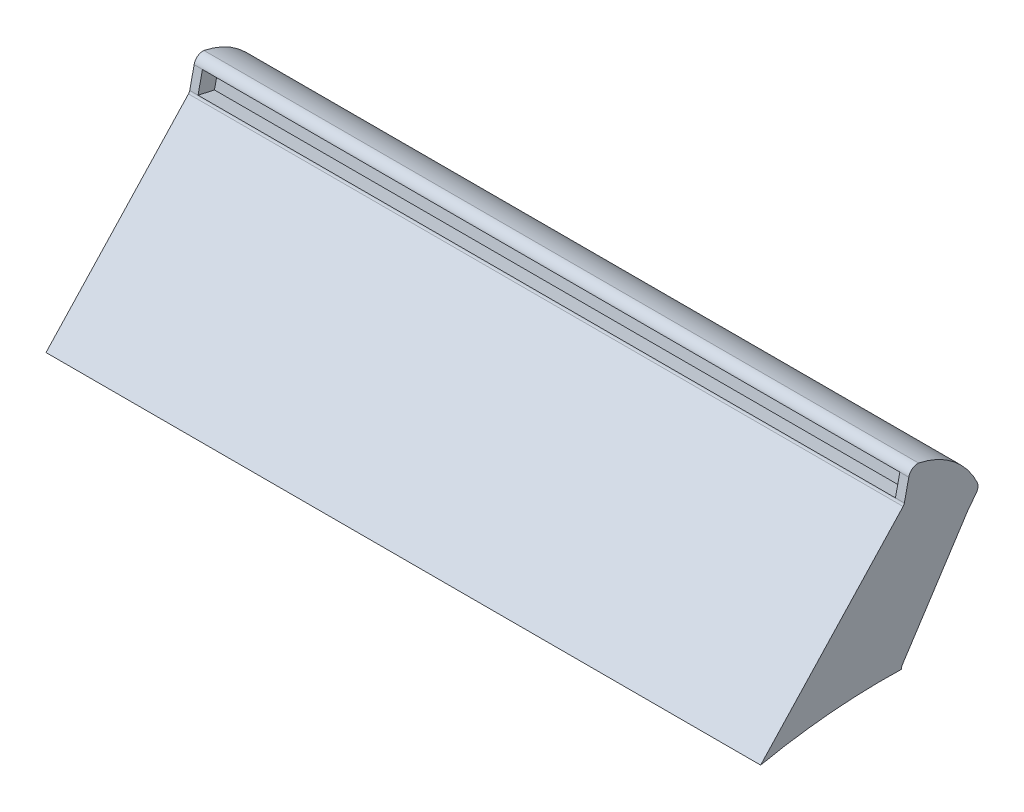
ISO-10303-21;
HEADER;
FILE_DESCRIPTION(('STEP AP214'),'2;1');
FILE_NAME('part.step','',(''),(''),'','','');
FILE_SCHEMA(('AUTOMOTIVE_DESIGN { 1 0 10303 214 1 1 1 1 }'));
ENDSEC;
DATA;
#1=APPLICATION_CONTEXT('core data for automotive mechanical design processes');
#2=APPLICATION_PROTOCOL_DEFINITION('international standard','automotive_design',2000,#1);
#3=PRODUCT_CONTEXT('',#1,'mechanical');
#4=PRODUCT('Part','Part','',(#3));
#5=PRODUCT_RELATED_PRODUCT_CATEGORY('part','',(#4));
#6=PRODUCT_DEFINITION_FORMATION('','',#4);
#7=PRODUCT_DEFINITION_CONTEXT('part definition',#1,'design');
#8=PRODUCT_DEFINITION('design','',#6,#7);
#9=PRODUCT_DEFINITION_SHAPE('','',#8);
#10=(LENGTH_UNIT() NAMED_UNIT(*) SI_UNIT(.MILLI.,.METRE.));
#11=(NAMED_UNIT(*) PLANE_ANGLE_UNIT() SI_UNIT($,.RADIAN.));
#12=(NAMED_UNIT(*) SI_UNIT($,.STERADIAN.) SOLID_ANGLE_UNIT());
#13=UNCERTAINTY_MEASURE_WITH_UNIT(LENGTH_MEASURE(1.E-05),#10,'distance_accuracy_value','');
#14=(GEOMETRIC_REPRESENTATION_CONTEXT(3) GLOBAL_UNCERTAINTY_ASSIGNED_CONTEXT((#13)) GLOBAL_UNIT_ASSIGNED_CONTEXT((#10,
#11,#12)) REPRESENTATION_CONTEXT('',''));
#15=CARTESIAN_POINT('',(0.,0.,0.));
#16=DIRECTION('',(0.,0.,1.));
#17=DIRECTION('',(1.,0.,0.));
#18=AXIS2_PLACEMENT_3D('',#15,#16,#17);
#19=CARTESIAN_POINT('',(850.,91.6693855460782,-23.2081270688611));
#20=DIRECTION('',(0.,-0.214598816365285,-0.976702282179487));
#21=DIRECTION('',(0.,0.976702282179487,-0.214598816365285));
#22=AXIS2_PLACEMENT_3D('',#19,#20,#21);
#23=PLANE('',#22);
#24=DIRECTION('',(-1.,0.,0.));
#25=VECTOR('',#24,1.);
#26=CARTESIAN_POINT('',(850.,91.6693855460782,-23.2081270688611));
#27=LINE('',#26,#25);
#28=CARTESIAN_POINT('',(9.87711763302313,91.6693855460782,-23.2081270688611));
#29=VERTEX_POINT('',#28);
#30=CARTESIAN_POINT('',(0.,91.6693855460782,-23.2081270688611));
#31=VERTEX_POINT('',#30);
#32=EDGE_CURVE('E148',#29,#31,#27,.T.);
#33=ORIENTED_EDGE('',*,*,#32,.F.);
#34=DIRECTION('',(0.,-0.976702282179487,0.214598816365285));
#35=VECTOR('',#34,1.);
#36=CARTESIAN_POINT('',(9.87711763302313,91.6693855460782,-23.2081270688611));
#37=LINE('',#36,#35);
#38=CARTESIAN_POINT('',(9.87711763302313,115.61840829184,-28.4701521793966));
#39=VERTEX_POINT('',#38);
#40=EDGE_CURVE('E48',#39,#29,#37,.T.);
#41=ORIENTED_EDGE('',*,*,#40,.F.);
#42=DIRECTION('',(-1.,0.,0.));
#43=VECTOR('',#42,1.);
#44=CARTESIAN_POINT('',(850.,115.61840829184,-28.4701521793966));
#45=LINE('',#44,#43);
#46=CARTESIAN_POINT('',(0.,115.61840829184,-28.4701521793966));
#47=VERTEX_POINT('',#46);
#48=EDGE_CURVE('E147',#39,#47,#45,.T.);
#49=ORIENTED_EDGE('',*,*,#48,.T.);
#50=DIRECTION('',(0.,-0.976702282179487,0.214598816365285));
#51=VECTOR('',#50,1.);
#52=CARTESIAN_POINT('',(0.,91.6693855460782,-23.2081270688611));
#53=LINE('',#52,#51);
#54=EDGE_CURVE('E204',#47,#31,#53,.T.);
#55=ORIENTED_EDGE('',*,*,#54,.T.);
#56=EDGE_LOOP('',(#33,#41,#49,#55));
#57=FACE_BOUND('',#56,.T.);
#58=ADVANCED_FACE('F33',(#57),#23,.F.);
#59=CARTESIAN_POINT('',(850.,-798.341819729579,0.409279889670433));
#60=DIRECTION('',(-1.,0.,0.));
#61=DIRECTION('',(0.,0.,1.));
#62=AXIS2_PLACEMENT_3D('',#59,#60,#61);
#63=CYLINDRICAL_SURFACE('',#62,720.751714267608);
#64=CARTESIAN_POINT('',(0.,-798.341819729579,0.409279889670433));
#65=DIRECTION('',(-1.,0.,0.));
#66=DIRECTION('',(0.,0.,-1.));
#67=AXIS2_PLACEMENT_3D('',#64,#65,#66);
#68=CIRCLE('',#67,720.751714267608);
#69=CARTESIAN_POINT('',(0.,-92.8090408894732,147.740646549501));
#70=VERTEX_POINT('',#69);
#71=CARTESIAN_POINT('',(0.,-77.868977882478,-19.6386072922121));
#72=VERTEX_POINT('',#71);
#73=EDGE_CURVE('E221',#70,#72,#68,.T.);
#74=ORIENTED_EDGE('',*,*,#73,.T.);
#75=DIRECTION('',(-1.,0.,0.));
#76=VECTOR('',#75,1.);
#77=CARTESIAN_POINT('',(850.,-77.868977882478,-19.6386072922121));
#78=LINE('',#77,#76);
#79=CARTESIAN_POINT('',(850.,-77.868977882478,-19.6386072922121));
#80=VERTEX_POINT('',#79);
#81=EDGE_CURVE('E11',#80,#72,#78,.T.);
#82=ORIENTED_EDGE('',*,*,#81,.F.);
#83=CARTESIAN_POINT('',(850.,-798.341819729579,0.409279889670433));
#84=DIRECTION('',(-1.,0.,0.));
#85=DIRECTION('',(0.,0.,-1.));
#86=AXIS2_PLACEMENT_3D('',#83,#84,#85);
#87=CIRCLE('',#86,720.751714267608);
#88=CARTESIAN_POINT('',(850.,-92.8090408894732,147.740646549501));
#89=VERTEX_POINT('',#88);
#90=EDGE_CURVE('E231',#89,#80,#87,.T.);
#91=ORIENTED_EDGE('',*,*,#90,.F.);
#92=DIRECTION('',(-1.,0.,0.));
#93=VECTOR('',#92,1.);
#94=CARTESIAN_POINT('',(850.,-92.8090408894732,147.740646549501));
#95=LINE('',#94,#93);
#96=EDGE_CURVE('E153',#89,#70,#95,.T.);
#97=ORIENTED_EDGE('',*,*,#96,.T.);
#98=EDGE_LOOP('',(#74,#82,#91,#97));
#99=FACE_BOUND('',#98,.T.);
#100=ADVANCED_FACE('F35',(#99),#63,.F.);
#101=CARTESIAN_POINT('',(850.,-77.8689778824766,-27.6386072922086));
#102=DIRECTION('',(-1.,0.,0.));
#103=DIRECTION('',(0.,0.,1.));
#104=AXIS2_PLACEMENT_3D('',#101,#102,#103);
#105=CYLINDRICAL_SURFACE('',#104,7.99999999999646);
#106=CARTESIAN_POINT('',(0.,-77.8689778824766,-27.6386072922086));
#107=DIRECTION('',(-1.,0.,0.));
#108=DIRECTION('',(0.,0.,-1.));
#109=AXIS2_PLACEMENT_3D('',#106,#107,#108);
#110=CIRCLE('',#109,7.99999999999646);
#111=CARTESIAN_POINT('',(0.,-73.5118656023578,-20.9292427486485));
#112=VERTEX_POINT('',#111);
#113=EDGE_CURVE('E275',#72,#112,#110,.T.);
#114=ORIENTED_EDGE('',*,*,#113,.T.);
#115=DIRECTION('',(-1.,0.,0.));
#116=VECTOR('',#115,1.);
#117=CARTESIAN_POINT('',(850.,-73.5118656023578,-20.9292427486485));
#118=LINE('',#117,#116);
#119=CARTESIAN_POINT('',(850.,-73.5118656023578,-20.9292427486485));
#120=VERTEX_POINT('',#119);
#121=EDGE_CURVE('E41',#120,#112,#118,.T.);
#122=ORIENTED_EDGE('',*,*,#121,.F.);
#123=CARTESIAN_POINT('',(850.,-77.8689778824766,-27.6386072922086));
#124=DIRECTION('',(-1.,0.,0.));
#125=DIRECTION('',(0.,0.,-1.));
#126=AXIS2_PLACEMENT_3D('',#123,#124,#125);
#127=CIRCLE('',#126,7.99999999999646);
#128=EDGE_CURVE('E104',#80,#120,#127,.T.);
#129=ORIENTED_EDGE('',*,*,#128,.F.);
#130=ORIENTED_EDGE('',*,*,#81,.T.);
#131=EDGE_LOOP('',(#114,#122,#129,#130));
#132=FACE_BOUND('',#131,.T.);
#133=ADVANCED_FACE('F189',(#132),#105,.F.);
#134=CARTESIAN_POINT('',(850.,47.4132262786012,-99.4589156242478));
#135=DIRECTION('',(0.,0.544639035015017,0.838670567945431));
#136=DIRECTION('',(0.,-0.838670567945431,0.544639035015017));
#137=AXIS2_PLACEMENT_3D('',#134,#135,#136);
#138=PLANE('',#137);
#139=DIRECTION('',(0.,0.838670567945431,-0.544639035015017));
#140=VECTOR('',#139,1.);
#141=CARTESIAN_POINT('',(0.,47.4132262786012,-99.4589156242478));
#142=LINE('',#141,#140);
#143=CARTESIAN_POINT('',(0.,47.4132262786012,-99.4589156242478));
#144=VERTEX_POINT('',#143);
#145=EDGE_CURVE('E270',#112,#144,#142,.T.);
#146=ORIENTED_EDGE('',*,*,#145,.T.);
#147=DIRECTION('',(-1.,0.,0.));
#148=VECTOR('',#147,1.);
#149=CARTESIAN_POINT('',(850.,47.4132262786012,-99.4589156242478));
#150=LINE('',#149,#148);
#151=CARTESIAN_POINT('',(850.,47.4132262786012,-99.4589156242478));
#152=VERTEX_POINT('',#151);
#153=EDGE_CURVE('E264',#152,#144,#150,.T.);
#154=ORIENTED_EDGE('',*,*,#153,.F.);
#155=DIRECTION('',(0.,0.838670567945431,-0.544639035015017));
#156=VECTOR('',#155,1.);
#157=CARTESIAN_POINT('',(850.,47.4132262786012,-99.4589156242478));
#158=LINE('',#157,#156);
#159=EDGE_CURVE('E234',#120,#152,#158,.T.);
#160=ORIENTED_EDGE('',*,*,#159,.F.);
#161=ORIENTED_EDGE('',*,*,#121,.T.);
#162=EDGE_LOOP('',(#146,#154,#160,#161));
#163=FACE_BOUND('',#162,.T.);
#164=ADVANCED_FACE('F186',(#163),#138,.F.);
#165=CARTESIAN_POINT('',(850.,59.907923142311,-109.338647669992));
#166=DIRECTION('',(0.,0.620243475564822,0.784409351690347));
#167=DIRECTION('',(0.,-0.784409351690347,0.620243475564822));
#168=AXIS2_PLACEMENT_3D('',#165,#166,#167);
#169=PLANE('',#168);
#170=DIRECTION('',(0.,0.784409351690347,-0.620243475564822));
#171=VECTOR('',#170,1.);
#172=CARTESIAN_POINT('',(0.,59.907923142311,-109.338647669992));
#173=LINE('',#172,#171);
#174=CARTESIAN_POINT('',(0.,59.907923142311,-109.338647669992));
#175=VERTEX_POINT('',#174);
#176=EDGE_CURVE('E277',#144,#175,#173,.T.);
#177=ORIENTED_EDGE('',*,*,#176,.T.);
#178=DIRECTION('',(-1.,0.,0.));
#179=VECTOR('',#178,1.);
#180=CARTESIAN_POINT('',(850.,59.907923142311,-109.338647669992));
#181=LINE('',#180,#179);
#182=CARTESIAN_POINT('',(850.,59.907923142311,-109.338647669992));
#183=VERTEX_POINT('',#182);
#184=EDGE_CURVE('E261',#183,#175,#181,.T.);
#185=ORIENTED_EDGE('',*,*,#184,.F.);
#186=DIRECTION('',(0.,0.784409351690347,-0.620243475564822));
#187=VECTOR('',#186,1.);
#188=CARTESIAN_POINT('',(850.,59.907923142311,-109.338647669992));
#189=LINE('',#188,#187);
#190=EDGE_CURVE('E236',#152,#183,#189,.T.);
#191=ORIENTED_EDGE('',*,*,#190,.F.);
#192=ORIENTED_EDGE('',*,*,#153,.T.);
#193=EDGE_LOOP('',(#177,#185,#191,#192));
#194=FACE_BOUND('',#193,.T.);
#195=ADVANCED_FACE('F182',(#194),#169,.F.);
#196=CARTESIAN_POINT('',(850.,65.3643259516161,-100.015089589692));
#197=DIRECTION('',(-1.,0.,0.));
#198=DIRECTION('',(0.,0.,1.));
#199=AXIS2_PLACEMENT_3D('',#196,#197,#198);
#200=CYLINDRICAL_SURFACE('',#199,10.802826801079);
#201=CARTESIAN_POINT('',(0.,65.3643259516161,-100.015089589692));
#202=DIRECTION('',(1.,0.,0.));
#203=DIRECTION('',(0.,0.,1.));
#204=AXIS2_PLACEMENT_3D('',#201,#202,#203);
#205=CIRCLE('',#204,10.802826801079);
#206=CARTESIAN_POINT('',(0.,69.5374016311797,-109.979351040836));
#207=VERTEX_POINT('',#206);
#208=EDGE_CURVE('E279',#175,#207,#205,.T.);
#209=ORIENTED_EDGE('',*,*,#208,.T.);
#210=DIRECTION('',(-1.,0.,0.));
#211=VECTOR('',#210,1.);
#212=CARTESIAN_POINT('',(850.,69.5374016311797,-109.979351040836));
#213=LINE('',#212,#211);
#214=CARTESIAN_POINT('',(850.,69.5374016311797,-109.979351040836));
#215=VERTEX_POINT('',#214);
#216=EDGE_CURVE('E252',#215,#207,#213,.T.);
#217=ORIENTED_EDGE('',*,*,#216,.F.);
#218=CARTESIAN_POINT('',(850.,65.3643259516161,-100.015089589692));
#219=DIRECTION('',(1.,0.,0.));
#220=DIRECTION('',(0.,0.,1.));
#221=AXIS2_PLACEMENT_3D('',#218,#219,#220);
#222=CIRCLE('',#221,10.802826801079);
#223=EDGE_CURVE('E238',#183,#215,#222,.T.);
#224=ORIENTED_EDGE('',*,*,#223,.F.);
#225=ORIENTED_EDGE('',*,*,#184,.T.);
#226=EDGE_LOOP('',(#209,#217,#224,#225));
#227=FACE_BOUND('',#226,.T.);
#228=ADVANCED_FACE('F178',(#227),#200,.T.);
#229=CARTESIAN_POINT('',(850.,26.8020066557608,-19.9145494502848));
#230=DIRECTION('',(-1.,0.,0.));
#231=DIRECTION('',(0.,0.,1.));
#232=AXIS2_PLACEMENT_3D('',#229,#230,#231);
#233=CYLINDRICAL_SURFACE('',#232,99.689430077869);
#234=CARTESIAN_POINT('',(0.,26.8020066557608,-19.9145494502848));
#235=DIRECTION('',(1.,0.,0.));
#236=DIRECTION('',(0.,0.,1.));
#237=AXIS2_PLACEMENT_3D('',#234,#235,#236);
#238=CIRCLE('',#237,99.689430077869);
#239=CARTESIAN_POINT('',(0.,124.42758644127,-40.0944563081866));
#240=VERTEX_POINT('',#239);
#241=EDGE_CURVE('E249',#207,#240,#238,.T.);
#242=ORIENTED_EDGE('',*,*,#241,.T.);
#243=DIRECTION('',(-1.,0.,0.));
#244=VECTOR('',#243,1.);
#245=CARTESIAN_POINT('',(850.,124.42758644127,-40.0944563081866));
#246=LINE('',#245,#244);
#247=CARTESIAN_POINT('',(850.,124.42758644127,-40.0944563081866));
#248=VERTEX_POINT('',#247);
#249=EDGE_CURVE('E247',#248,#240,#246,.T.);
#250=ORIENTED_EDGE('',*,*,#249,.F.);
#251=CARTESIAN_POINT('',(850.,26.8020066557608,-19.9145494502848));
#252=DIRECTION('',(1.,0.,0.));
#253=DIRECTION('',(0.,0.,1.));
#254=AXIS2_PLACEMENT_3D('',#251,#252,#253);
#255=CIRCLE('',#254,99.689430077869);
#256=EDGE_CURVE('E240',#215,#248,#255,.T.);
#257=ORIENTED_EDGE('',*,*,#256,.F.);
#258=ORIENTED_EDGE('',*,*,#216,.T.);
#259=EDGE_LOOP('',(#242,#250,#257,#258));
#260=FACE_BOUND('',#259,.T.);
#261=ADVANCED_FACE('F174',(#260),#233,.T.);
#262=CARTESIAN_POINT('',(850.,113.678342784347,-39.0904365751577));
#263=DIRECTION('',(-1.,0.,0.));
#264=DIRECTION('',(0.,0.,1.));
#265=AXIS2_PLACEMENT_3D('',#262,#263,#264);
#266=CYLINDRICAL_SURFACE('',#265,10.7960314384597);
#267=CARTESIAN_POINT('',(0.,113.678342784347,-39.0904365751577));
#268=DIRECTION('',(1.,0.,0.));
#269=DIRECTION('',(0.,0.,1.));
#270=AXIS2_PLACEMENT_3D('',#267,#268,#269);
#271=CIRCLE('',#270,10.7960314384597);
#272=EDGE_CURVE('E285',#240,#47,#271,.T.);
#273=ORIENTED_EDGE('',*,*,#272,.T.);
#274=ORIENTED_EDGE('',*,*,#48,.F.);
#275=DIRECTION('',(-1.,0.,0.));
#276=VECTOR('',#275,1.);
#277=CARTESIAN_POINT('',(9.87711763302313,115.61840829184,-28.4701521793966));
#278=LINE('',#277,#276);
#279=CARTESIAN_POINT('',(839.380265403887,115.61840829184,-28.4701521793966));
#280=VERTEX_POINT('',#279);
#281=EDGE_CURVE('E211',#280,#39,#278,.T.);
#282=ORIENTED_EDGE('',*,*,#281,.F.);
#283=CARTESIAN_POINT('',(850.,115.61840829184,-28.4701521793966));
#284=VERTEX_POINT('',#283);
#285=EDGE_CURVE('E253',#284,#280,#45,.T.);
#286=ORIENTED_EDGE('',*,*,#285,.F.);
#287=CARTESIAN_POINT('',(850.,113.678342784347,-39.0904365751577));
#288=DIRECTION('',(1.,0.,0.));
#289=DIRECTION('',(0.,0.,1.));
#290=AXIS2_PLACEMENT_3D('',#287,#288,#289);
#291=CIRCLE('',#290,10.7960314384597);
#292=EDGE_CURVE('E133',#248,#284,#291,.T.);
#293=ORIENTED_EDGE('',*,*,#292,.F.);
#294=ORIENTED_EDGE('',*,*,#249,.T.);
#295=EDGE_LOOP('',(#273,#274,#282,#286,#293,#294));
#296=FACE_BOUND('',#295,.T.);
#297=ADVANCED_FACE('F171',(#296),#266,.T.);
#298=ORIENTED_EDGE('',*,*,#285,.T.);
#299=DIRECTION('',(0.,0.976702282179487,-0.214598816365285));
#300=VECTOR('',#299,1.);
#301=CARTESIAN_POINT('',(839.380265403887,91.6693855460782,-23.2081270688611));
#302=LINE('',#301,#300);
#303=CARTESIAN_POINT('',(839.380265403887,91.6693855460782,-23.2081270688611));
#304=VERTEX_POINT('',#303);
#305=EDGE_CURVE('E144',#304,#280,#302,.T.);
#306=ORIENTED_EDGE('',*,*,#305,.F.);
#307=CARTESIAN_POINT('',(850.,91.6693855460782,-23.2081270688611));
#308=VERTEX_POINT('',#307);
#309=EDGE_CURVE('E140',#308,#304,#27,.T.);
#310=ORIENTED_EDGE('',*,*,#309,.F.);
#311=DIRECTION('',(0.,-0.976702282179487,0.214598816365285));
#312=VECTOR('',#311,1.);
#313=CARTESIAN_POINT('',(850.,91.6693855460782,-23.2081270688611));
#314=LINE('',#313,#312);
#315=EDGE_CURVE('E126',#284,#308,#314,.T.);
#316=ORIENTED_EDGE('',*,*,#315,.F.);
#317=EDGE_LOOP('',(#298,#306,#310,#316));
#318=FACE_BOUND('',#317,.T.);
#319=ADVANCED_FACE('F141',(#318),#23,.F.);
#320=CARTESIAN_POINT('',(850.,91.6693855460782,-23.2081270688611));
#321=CARTESIAN_POINT('',(850.,90.074456326725,-22.8463535463853));
#322=CARTESIAN_POINT('',(850.,88.8758626372834,-21.7379334926742));
#323=B_SPLINE_CURVE_WITH_KNOTS('',2,(#320,#321,#322),.UNSPECIFIED.,.F.,.F.,(3,3),(0.,1.),.UNSPECIFIED.);
#324=DIRECTION('',(-1.,0.,0.));
#325=VECTOR('',#324,1.);
#326=SURFACE_OF_LINEAR_EXTRUSION('',#323,#325);
#327=CARTESIAN_POINT('',(0.,91.6693855460782,-23.2081270688611));
#328=CARTESIAN_POINT('',(0.,90.074456326725,-22.8463535463853));
#329=CARTESIAN_POINT('',(0.,88.8758626372834,-21.7379334926742));
#330=B_SPLINE_CURVE_WITH_KNOTS('',2,(#327,#328,#329),.UNSPECIFIED.,.F.,.F.,(3,3),(0.,1.),.UNSPECIFIED.);
#331=CARTESIAN_POINT('',(0.,88.8758626372834,-21.7379334926742));
#332=VERTEX_POINT('',#331);
#333=EDGE_CURVE('E288',#31,#332,#330,.T.);
#334=ORIENTED_EDGE('',*,*,#333,.T.);
#335=DIRECTION('',(-1.,0.,0.));
#336=VECTOR('',#335,1.);
#337=CARTESIAN_POINT('',(850.,88.8758626372834,-21.7379334926742));
#338=LINE('',#337,#336);
#339=CARTESIAN_POINT('',(850.,88.8758626372834,-21.7379334926742));
#340=VERTEX_POINT('',#339);
#341=EDGE_CURVE('E151',#340,#332,#338,.T.);
#342=ORIENTED_EDGE('',*,*,#341,.F.);
#343=EDGE_CURVE('E130',#308,#340,#323,.T.);
#344=ORIENTED_EDGE('',*,*,#343,.F.);
#345=ORIENTED_EDGE('',*,*,#309,.T.);
#346=DIRECTION('',(1.,0.,0.));
#347=VECTOR('',#346,1.);
#348=CARTESIAN_POINT('',(9.87711763302313,91.6693855460782,-23.2081270688611));
#349=LINE('',#348,#347);
#350=EDGE_CURVE('E207',#29,#304,#349,.T.);
#351=ORIENTED_EDGE('',*,*,#350,.F.);
#352=ORIENTED_EDGE('',*,*,#32,.T.);
#353=EDGE_LOOP('',(#334,#342,#344,#345,#351,#352));
#354=FACE_BOUND('',#353,.T.);
#355=ADVANCED_FACE('F150',(#354),#326,.F.);
#356=CARTESIAN_POINT('',(850.,-92.8090408894732,147.740646549501));
#357=DIRECTION('',(0.,-0.682116036006348,-0.731243949324018));
#358=DIRECTION('',(0.,0.731243949324018,-0.682116036006348));
#359=AXIS2_PLACEMENT_3D('',#356,#357,#358);
#360=PLANE('',#359);
#361=DIRECTION('',(0.,-0.731243949324018,0.682116036006348));
#362=VECTOR('',#361,1.);
#363=CARTESIAN_POINT('',(0.,-92.8090408894732,147.740646549501));
#364=LINE('',#363,#362);
#365=EDGE_CURVE('E96',#332,#70,#364,.T.);
#366=ORIENTED_EDGE('',*,*,#365,.T.);
#367=ORIENTED_EDGE('',*,*,#96,.F.);
#368=DIRECTION('',(0.,-0.731243949324018,0.682116036006348));
#369=VECTOR('',#368,1.);
#370=CARTESIAN_POINT('',(850.,-92.8090408894732,147.740646549501));
#371=LINE('',#370,#369);
#372=EDGE_CURVE('E57',#340,#89,#371,.T.);
#373=ORIENTED_EDGE('',*,*,#372,.F.);
#374=ORIENTED_EDGE('',*,*,#341,.T.);
#375=EDGE_LOOP('',(#366,#367,#373,#374));
#376=FACE_BOUND('',#375,.T.);
#377=ADVANCED_FACE('F167',(#376),#360,.F.);
#378=CARTESIAN_POINT('',(850.,-798.341819729579,0.409279889670433));
#379=DIRECTION('',(1.,0.,0.));
#380=DIRECTION('',(0.,0.,-1.));
#381=AXIS2_PLACEMENT_3D('',#378,#379,#380);
#382=PLANE('',#381);
#383=ORIENTED_EDGE('',*,*,#90,.T.);
#384=ORIENTED_EDGE('',*,*,#128,.T.);
#385=ORIENTED_EDGE('',*,*,#159,.T.);
#386=ORIENTED_EDGE('',*,*,#190,.T.);
#387=ORIENTED_EDGE('',*,*,#223,.T.);
#388=ORIENTED_EDGE('',*,*,#256,.T.);
#389=ORIENTED_EDGE('',*,*,#292,.T.);
#390=ORIENTED_EDGE('',*,*,#315,.T.);
#391=ORIENTED_EDGE('',*,*,#343,.T.);
#392=ORIENTED_EDGE('',*,*,#372,.T.);
#393=EDGE_LOOP('',(#383,#384,#385,#386,#387,#388,#389,#390,#391,#392));
#394=FACE_BOUND('',#393,.T.);
#395=ADVANCED_FACE('F128',(#394),#382,.T.);
#396=CARTESIAN_POINT('',(0.,-798.341819729579,0.409279889670433));
#397=DIRECTION('',(1.,0.,0.));
#398=DIRECTION('',(0.,0.,-1.));
#399=AXIS2_PLACEMENT_3D('',#396,#397,#398);
#400=PLANE('',#399);
#401=ORIENTED_EDGE('',*,*,#73,.F.);
#402=ORIENTED_EDGE('',*,*,#365,.F.);
#403=ORIENTED_EDGE('',*,*,#333,.F.);
#404=ORIENTED_EDGE('',*,*,#54,.F.);
#405=ORIENTED_EDGE('',*,*,#272,.F.);
#406=ORIENTED_EDGE('',*,*,#241,.F.);
#407=ORIENTED_EDGE('',*,*,#208,.F.);
#408=ORIENTED_EDGE('',*,*,#176,.F.);
#409=ORIENTED_EDGE('',*,*,#145,.F.);
#410=ORIENTED_EDGE('',*,*,#113,.F.);
#411=EDGE_LOOP('',(#401,#402,#403,#404,#405,#406,#407,#408,#409,#410));
#412=FACE_BOUND('',#411,.T.);
#413=ADVANCED_FACE('F274',(#412),#400,.F.);
#414=CARTESIAN_POINT('',(9.87711763302313,87.3774092187725,-42.7421727124509));
#415=DIRECTION('',(-1.,0.,0.));
#416=DIRECTION('',(0.,0.,1.));
#417=AXIS2_PLACEMENT_3D('',#414,#415,#416);
#418=PLANE('',#417);
#419=ORIENTED_EDGE('',*,*,#40,.T.);
#420=DIRECTION('',(0.,0.214598816365285,0.976702282179487));
#421=VECTOR('',#420,1.);
#422=CARTESIAN_POINT('',(9.87711763302313,87.3774092187725,-42.7421727124509));
#423=LINE('',#422,#421);
#424=CARTESIAN_POINT('',(9.87711763302313,87.3774092187725,-42.7421727124509));
#425=VERTEX_POINT('',#424);
#426=EDGE_CURVE('E228',#425,#29,#423,.T.);
#427=ORIENTED_EDGE('',*,*,#426,.F.);
#428=DIRECTION('',(0.,-0.976702282179487,0.214598816365285));
#429=VECTOR('',#428,1.);
#430=CARTESIAN_POINT('',(9.87711763302313,87.3774092187725,-42.7421727124509));
#431=LINE('',#430,#429);
#432=CARTESIAN_POINT('',(9.87711763302313,111.326431964535,-48.0041978229864));
#433=VERTEX_POINT('',#432);
#434=EDGE_CURVE('E218',#433,#425,#431,.T.);
#435=ORIENTED_EDGE('',*,*,#434,.F.);
#436=DIRECTION('',(0.,0.214598816365285,0.976702282179487));
#437=VECTOR('',#436,1.);
#438=CARTESIAN_POINT('',(9.87711763302313,111.326431964535,-48.0041978229864));
#439=LINE('',#438,#437);
#440=EDGE_CURVE('E219',#433,#39,#439,.T.);
#441=ORIENTED_EDGE('',*,*,#440,.T.);
#442=EDGE_LOOP('',(#419,#427,#435,#441));
#443=FACE_BOUND('',#442,.T.);
#444=ADVANCED_FACE('F331',(#443),#418,.F.);
#445=CARTESIAN_POINT('',(9.87711763302313,111.326431964535,-48.0041978229864));
#446=DIRECTION('',(0.,0.976702282179487,-0.214598816365285));
#447=DIRECTION('',(0.,0.214598816365285,0.976702282179487));
#448=AXIS2_PLACEMENT_3D('',#445,#446,#447);
#449=PLANE('',#448);
#450=ORIENTED_EDGE('',*,*,#281,.T.);
#451=ORIENTED_EDGE('',*,*,#440,.F.);
#452=DIRECTION('',(-1.,0.,0.));
#453=VECTOR('',#452,1.);
#454=CARTESIAN_POINT('',(9.87711763302313,111.326431964535,-48.0041978229864));
#455=LINE('',#454,#453);
#456=CARTESIAN_POINT('',(839.380265403887,111.326431964535,-48.0041978229864));
#457=VERTEX_POINT('',#456);
#458=EDGE_CURVE('E230',#457,#433,#455,.T.);
#459=ORIENTED_EDGE('',*,*,#458,.F.);
#460=DIRECTION('',(0.,0.214598816365285,0.976702282179487));
#461=VECTOR('',#460,1.);
#462=CARTESIAN_POINT('',(839.380265403887,111.326431964535,-48.0041978229864));
#463=LINE('',#462,#461);
#464=EDGE_CURVE('E222',#457,#280,#463,.T.);
#465=ORIENTED_EDGE('',*,*,#464,.T.);
#466=EDGE_LOOP('',(#450,#451,#459,#465));
#467=FACE_BOUND('',#466,.T.);
#468=ADVANCED_FACE('F330',(#467),#449,.F.);
#469=CARTESIAN_POINT('',(839.380265403887,87.3774092187725,-42.7421727124509));
#470=DIRECTION('',(1.,0.,0.));
#471=DIRECTION('',(0.,0.,-1.));
#472=AXIS2_PLACEMENT_3D('',#469,#470,#471);
#473=PLANE('',#472);
#474=ORIENTED_EDGE('',*,*,#305,.T.);
#475=ORIENTED_EDGE('',*,*,#464,.F.);
#476=DIRECTION('',(0.,0.976702282179487,-0.214598816365285));
#477=VECTOR('',#476,1.);
#478=CARTESIAN_POINT('',(839.380265403887,87.3774092187725,-42.7421727124509));
#479=LINE('',#478,#477);
#480=CARTESIAN_POINT('',(839.380265403887,87.3774092187725,-42.7421727124509));
#481=VERTEX_POINT('',#480);
#482=EDGE_CURVE('E322',#481,#457,#479,.T.);
#483=ORIENTED_EDGE('',*,*,#482,.F.);
#484=DIRECTION('',(0.,0.214598816365285,0.976702282179487));
#485=VECTOR('',#484,1.);
#486=CARTESIAN_POINT('',(839.380265403887,87.3774092187725,-42.7421727124509));
#487=LINE('',#486,#485);
#488=EDGE_CURVE('E225',#481,#304,#487,.T.);
#489=ORIENTED_EDGE('',*,*,#488,.T.);
#490=EDGE_LOOP('',(#474,#475,#483,#489));
#491=FACE_BOUND('',#490,.T.);
#492=ADVANCED_FACE('F323',(#491),#473,.F.);
#493=CARTESIAN_POINT('',(9.87711763302313,87.3774092187725,-42.7421727124509));
#494=DIRECTION('',(0.,-0.976702282179487,0.214598816365285));
#495=DIRECTION('',(0.,-0.214598816365285,-0.976702282179487));
#496=AXIS2_PLACEMENT_3D('',#493,#494,#495);
#497=PLANE('',#496);
#498=ORIENTED_EDGE('',*,*,#350,.T.);
#499=ORIENTED_EDGE('',*,*,#488,.F.);
#500=DIRECTION('',(1.,0.,0.));
#501=VECTOR('',#500,1.);
#502=CARTESIAN_POINT('',(9.87711763302313,87.3774092187725,-42.7421727124509));
#503=LINE('',#502,#501);
#504=EDGE_CURVE('E318',#425,#481,#503,.T.);
#505=ORIENTED_EDGE('',*,*,#504,.F.);
#506=ORIENTED_EDGE('',*,*,#426,.T.);
#507=EDGE_LOOP('',(#498,#499,#505,#506));
#508=FACE_BOUND('',#507,.T.);
#509=ADVANCED_FACE('F316',(#508),#497,.F.);
#510=CARTESIAN_POINT('',(0.,-4.93476180956392,-22.459551282935));
#511=DIRECTION('',(0.,-0.214598816365285,-0.976702282179487));
#512=DIRECTION('',(0.,0.976702282179487,-0.214598816365285));
#513=AXIS2_PLACEMENT_3D('',#510,#511,#512);
#514=PLANE('',#513);
#515=ORIENTED_EDGE('',*,*,#434,.T.);
#516=ORIENTED_EDGE('',*,*,#504,.T.);
#517=ORIENTED_EDGE('',*,*,#482,.T.);
#518=ORIENTED_EDGE('',*,*,#458,.T.);
#519=EDGE_LOOP('',(#515,#516,#517,#518));
#520=FACE_BOUND('',#519,.T.);
#521=ADVANCED_FACE('F327',(#520),#514,.F.);
#522=CLOSED_SHELL('',(#58,#100,#133,#164,#195,#228,#261,#297,#319,#355,#377,#395,#413,#444,#468,
#492,#509,#521));
#523=MANIFOLD_SOLID_BREP('B2',#522);
#524=ADVANCED_BREP_SHAPE_REPRESENTATION('',(#18,#523),#14);
#525=SHAPE_DEFINITION_REPRESENTATION(#9,#524);
ENDSEC;
END-ISO-10303-21;
